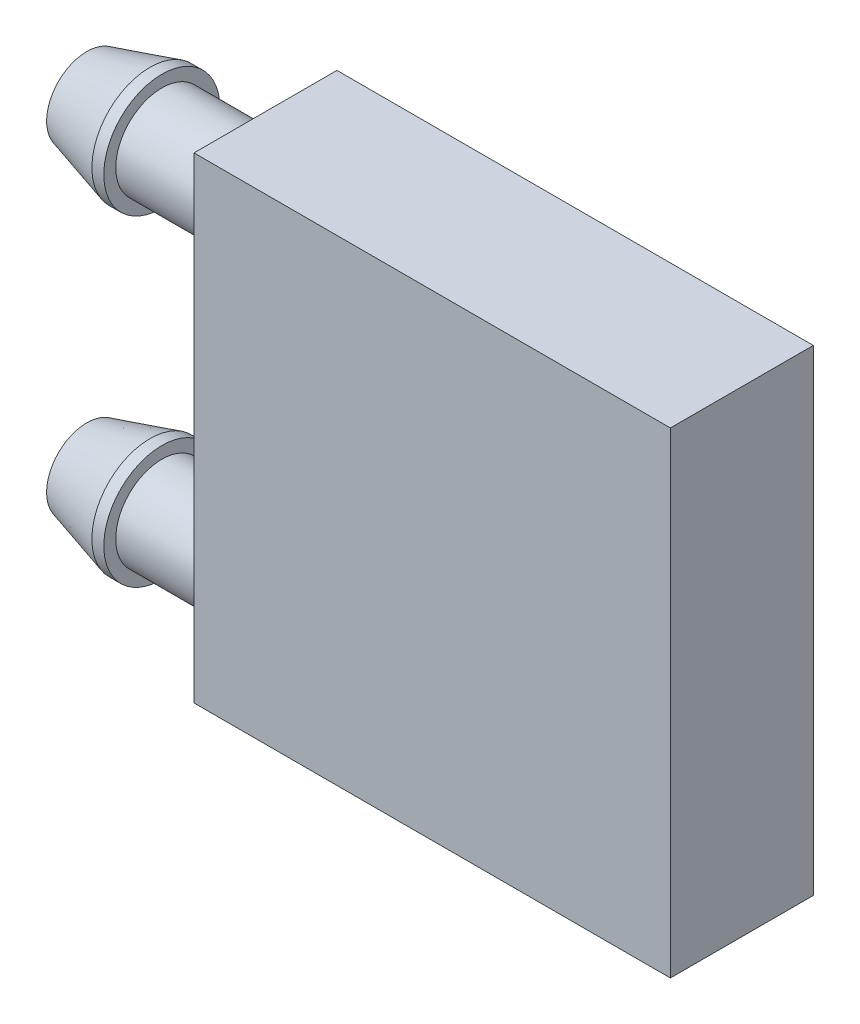
ISO-10303-21;
HEADER;
FILE_DESCRIPTION(('STEP AP214'),'2;1');
FILE_NAME('part.step','',(''),(''),'','','');
FILE_SCHEMA(('AUTOMOTIVE_DESIGN { 1 0 10303 214 1 1 1 1 }'));
ENDSEC;
DATA;
#1=APPLICATION_CONTEXT('core data for automotive mechanical design processes');
#2=APPLICATION_PROTOCOL_DEFINITION('international standard','automotive_design',2000,#1);
#3=PRODUCT_CONTEXT('',#1,'mechanical');
#4=PRODUCT('Part','Part','',(#3));
#5=PRODUCT_RELATED_PRODUCT_CATEGORY('part','',(#4));
#6=PRODUCT_DEFINITION_FORMATION('','',#4);
#7=PRODUCT_DEFINITION_CONTEXT('part definition',#1,'design');
#8=PRODUCT_DEFINITION('design','',#6,#7);
#9=PRODUCT_DEFINITION_SHAPE('','',#8);
#10=(LENGTH_UNIT() NAMED_UNIT(*) SI_UNIT(.MILLI.,.METRE.));
#11=(NAMED_UNIT(*) PLANE_ANGLE_UNIT() SI_UNIT($,.RADIAN.));
#12=(NAMED_UNIT(*) SI_UNIT($,.STERADIAN.) SOLID_ANGLE_UNIT());
#13=UNCERTAINTY_MEASURE_WITH_UNIT(LENGTH_MEASURE(1.E-05),#10,'distance_accuracy_value','');
#14=(GEOMETRIC_REPRESENTATION_CONTEXT(3) GLOBAL_UNCERTAINTY_ASSIGNED_CONTEXT((#13)) GLOBAL_UNIT_ASSIGNED_CONTEXT((#10,
#11,#12)) REPRESENTATION_CONTEXT('',''));
#15=CARTESIAN_POINT('',(0.,0.,0.));
#16=DIRECTION('',(0.,0.,1.));
#17=DIRECTION('',(1.,0.,0.));
#18=AXIS2_PLACEMENT_3D('',#15,#16,#17);
#19=CARTESIAN_POINT('',(-30.000000005,20.,-6.));
#20=DIRECTION('',(-1.,0.,0.));
#21=DIRECTION('',(0.,-1.,0.));
#22=AXIS2_PLACEMENT_3D('',#19,#20,#21);
#23=PLANE('',#22);
#24=CARTESIAN_POINT('',(-30.000000005,-13.5,0.));
#25=DIRECTION('',(-1.,0.,0.));
#26=DIRECTION('',(0.,-1.,0.));
#27=AXIS2_PLACEMENT_3D('',#24,#25,#26);
#28=CIRCLE('',#27,4.87500009200001);
#29=CARTESIAN_POINT('',(-30.000000005,-18.375000092,0.));
#30=VERTEX_POINT('',#29);
#31=EDGE_CURVE('E53',#30,#30,#28,.T.);
#32=ORIENTED_EDGE('',*,*,#31,.F.);
#33=EDGE_LOOP('',(#32));
#34=FACE_BOUND('',#33,.T.);
#35=CARTESIAN_POINT('',(-30.000000005,13.5,0.));
#36=DIRECTION('',(-1.,0.,0.));
#37=DIRECTION('',(0.,-1.,0.));
#38=AXIS2_PLACEMENT_3D('',#35,#36,#37);
#39=CIRCLE('',#38,4.87500009200001);
#40=CARTESIAN_POINT('',(-30.000000005,8.62499990799999,0.));
#41=VERTEX_POINT('',#40);
#42=EDGE_CURVE('E321',#41,#41,#39,.T.);
#43=ORIENTED_EDGE('',*,*,#42,.F.);
#44=EDGE_LOOP('',(#43));
#45=FACE_BOUND('',#44,.T.);
#46=DIRECTION('',(0.,0.,1.));
#47=VECTOR('',#46,1.);
#48=CARTESIAN_POINT('',(-30.000000005,-20.,-6.));
#49=LINE('',#48,#47);
#50=CARTESIAN_POINT('',(-30.000000005,-20.,-6.));
#51=VERTEX_POINT('',#50);
#52=CARTESIAN_POINT('',(-30.000000005,-20.,6.));
#53=VERTEX_POINT('',#52);
#54=EDGE_CURVE('E93',#51,#53,#49,.T.);
#55=ORIENTED_EDGE('',*,*,#54,.T.);
#56=DIRECTION('',(0.,-1.,0.));
#57=VECTOR('',#56,1.);
#58=CARTESIAN_POINT('',(-30.000000005,20.,6.));
#59=LINE('',#58,#57);
#60=CARTESIAN_POINT('',(-30.000000005,20.,6.));
#61=VERTEX_POINT('',#60);
#62=EDGE_CURVE('E96',#61,#53,#59,.T.);
#63=ORIENTED_EDGE('',*,*,#62,.F.);
#64=DIRECTION('',(0.,0.,1.));
#65=VECTOR('',#64,1.);
#66=CARTESIAN_POINT('',(-30.000000005,20.,-6.));
#67=LINE('',#66,#65);
#68=CARTESIAN_POINT('',(-30.000000005,20.,-6.));
#69=VERTEX_POINT('',#68);
#70=EDGE_CURVE('E63',#69,#61,#67,.T.);
#71=ORIENTED_EDGE('',*,*,#70,.F.);
#72=DIRECTION('',(0.,-1.,0.));
#73=VECTOR('',#72,1.);
#74=CARTESIAN_POINT('',(-30.000000005,20.,-6.));
#75=LINE('',#74,#73);
#76=EDGE_CURVE('E97',#69,#51,#75,.T.);
#77=ORIENTED_EDGE('',*,*,#76,.T.);
#78=EDGE_LOOP('',(#55,#63,#71,#77));
#79=FACE_BOUND('',#78,.T.);
#80=ADVANCED_FACE('F45',(#34,#45,#79),#23,.T.);
#81=CARTESIAN_POINT('',(-30.000000005,20.,-6.));
#82=DIRECTION('',(0.,1.,0.));
#83=DIRECTION('',(0.,0.,1.));
#84=AXIS2_PLACEMENT_3D('',#81,#82,#83);
#85=PLANE('',#84);
#86=ORIENTED_EDGE('',*,*,#70,.T.);
#87=DIRECTION('',(-1.,0.,0.));
#88=VECTOR('',#87,1.);
#89=CARTESIAN_POINT('',(-30.000000005,20.,6.));
#90=LINE('',#89,#88);
#91=CARTESIAN_POINT('',(10.000000005,20.,6.));
#92=VERTEX_POINT('',#91);
#93=EDGE_CURVE('E116',#92,#61,#90,.T.);
#94=ORIENTED_EDGE('',*,*,#93,.F.);
#95=DIRECTION('',(0.,0.,1.));
#96=VECTOR('',#95,1.);
#97=CARTESIAN_POINT('',(10.000000005,20.,-6.));
#98=LINE('',#97,#96);
#99=CARTESIAN_POINT('',(10.000000005,20.,-6.));
#100=VERTEX_POINT('',#99);
#101=EDGE_CURVE('E73',#100,#92,#98,.T.);
#102=ORIENTED_EDGE('',*,*,#101,.F.);
#103=DIRECTION('',(-1.,0.,0.));
#104=VECTOR('',#103,1.);
#105=CARTESIAN_POINT('',(-30.000000005,20.,-6.));
#106=LINE('',#105,#104);
#107=EDGE_CURVE('E103',#100,#69,#106,.T.);
#108=ORIENTED_EDGE('',*,*,#107,.T.);
#109=EDGE_LOOP('',(#86,#94,#102,#108));
#110=FACE_BOUND('',#109,.T.);
#111=ADVANCED_FACE('F179',(#110),#85,.T.);
#112=CARTESIAN_POINT('',(10.000000005,20.,-6.));
#113=DIRECTION('',(1.,0.,0.));
#114=DIRECTION('',(0.,0.,-1.));
#115=AXIS2_PLACEMENT_3D('',#112,#113,#114);
#116=PLANE('',#115);
#117=ORIENTED_EDGE('',*,*,#101,.T.);
#118=DIRECTION('',(0.,1.,0.));
#119=VECTOR('',#118,1.);
#120=CARTESIAN_POINT('',(10.000000005,20.,6.));
#121=LINE('',#120,#119);
#122=CARTESIAN_POINT('',(10.000000005,-20.,6.));
#123=VERTEX_POINT('',#122);
#124=EDGE_CURVE('E112',#123,#92,#121,.T.);
#125=ORIENTED_EDGE('',*,*,#124,.F.);
#126=DIRECTION('',(0.,0.,1.));
#127=VECTOR('',#126,1.);
#128=CARTESIAN_POINT('',(10.000000005,-20.,-6.));
#129=LINE('',#128,#127);
#130=CARTESIAN_POINT('',(10.000000005,-20.,-6.));
#131=VERTEX_POINT('',#130);
#132=EDGE_CURVE('E102',#131,#123,#129,.T.);
#133=ORIENTED_EDGE('',*,*,#132,.F.);
#134=DIRECTION('',(0.,1.,0.));
#135=VECTOR('',#134,1.);
#136=CARTESIAN_POINT('',(10.000000005,20.,-6.));
#137=LINE('',#136,#135);
#138=EDGE_CURVE('E173',#131,#100,#137,.T.);
#139=ORIENTED_EDGE('',*,*,#138,.T.);
#140=EDGE_LOOP('',(#117,#125,#133,#139));
#141=FACE_BOUND('',#140,.T.);
#142=ADVANCED_FACE('F300',(#141),#116,.T.);
#143=CARTESIAN_POINT('',(-30.000000005,-20.,-6.));
#144=DIRECTION('',(0.,-1.,0.));
#145=DIRECTION('',(0.,0.,-1.));
#146=AXIS2_PLACEMENT_3D('',#143,#144,#145);
#147=PLANE('',#146);
#148=ORIENTED_EDGE('',*,*,#132,.T.);
#149=DIRECTION('',(1.,0.,0.));
#150=VECTOR('',#149,1.);
#151=CARTESIAN_POINT('',(-30.000000005,-20.,6.));
#152=LINE('',#151,#150);
#153=EDGE_CURVE('E106',#53,#123,#152,.T.);
#154=ORIENTED_EDGE('',*,*,#153,.F.);
#155=ORIENTED_EDGE('',*,*,#54,.F.);
#156=DIRECTION('',(1.,0.,0.));
#157=VECTOR('',#156,1.);
#158=CARTESIAN_POINT('',(-30.000000005,-20.,-6.));
#159=LINE('',#158,#157);
#160=EDGE_CURVE('E145',#51,#131,#159,.T.);
#161=ORIENTED_EDGE('',*,*,#160,.T.);
#162=EDGE_LOOP('',(#148,#154,#155,#161));
#163=FACE_BOUND('',#162,.T.);
#164=ADVANCED_FACE('F107',(#163),#147,.T.);
#165=CARTESIAN_POINT('',(0.,0.,-6.));
#166=DIRECTION('',(0.,0.,1.));
#167=DIRECTION('',(1.,0.,0.));
#168=AXIS2_PLACEMENT_3D('',#165,#166,#167);
#169=PLANE('',#168);
#170=ORIENTED_EDGE('',*,*,#76,.F.);
#171=ORIENTED_EDGE('',*,*,#107,.F.);
#172=ORIENTED_EDGE('',*,*,#138,.F.);
#173=ORIENTED_EDGE('',*,*,#160,.F.);
#174=EDGE_LOOP('',(#170,#171,#172,#173));
#175=FACE_BOUND('',#174,.T.);
#176=ADVANCED_FACE('F182',(#175),#169,.F.);
#177=CARTESIAN_POINT('',(0.,0.,6.));
#178=DIRECTION('',(0.,0.,1.));
#179=DIRECTION('',(1.,0.,0.));
#180=AXIS2_PLACEMENT_3D('',#177,#178,#179);
#181=PLANE('',#180);
#182=ORIENTED_EDGE('',*,*,#62,.T.);
#183=ORIENTED_EDGE('',*,*,#153,.T.);
#184=ORIENTED_EDGE('',*,*,#124,.T.);
#185=ORIENTED_EDGE('',*,*,#93,.T.);
#186=EDGE_LOOP('',(#182,#183,#184,#185));
#187=FACE_BOUND('',#186,.T.);
#188=ADVANCED_FACE('F115',(#187),#181,.T.);
#189=CARTESIAN_POINT('',(-30.,13.5,0.));
#190=DIRECTION('',(1.,0.,0.));
#191=DIRECTION('',(0.,0.,-1.));
#192=AXIS2_PLACEMENT_3D('',#189,#190,#191);
#193=CYLINDRICAL_SURFACE('',#192,2.875000092);
#194=CARTESIAN_POINT('',(-30.000000005,13.5,0.));
#195=DIRECTION('',(-1.,0.,0.));
#196=DIRECTION('',(0.,-1.,0.));
#197=AXIS2_PLACEMENT_3D('',#194,#195,#196);
#198=CIRCLE('',#197,2.875000092);
#199=CARTESIAN_POINT('',(-30.000000005,10.624999908,0.));
#200=VERTEX_POINT('',#199);
#201=EDGE_CURVE('E187',#200,#200,#198,.F.);
#202=ORIENTED_EDGE('',*,*,#201,.T.);
#203=EDGE_LOOP('',(#202));
#204=FACE_BOUND('',#203,.T.);
#205=CARTESIAN_POINT('',(-45.000000005,13.5,0.));
#206=DIRECTION('',(1.,0.,0.));
#207=DIRECTION('',(0.,0.,-1.));
#208=AXIS2_PLACEMENT_3D('',#205,#206,#207);
#209=CIRCLE('',#208,2.875000092);
#210=CARTESIAN_POINT('',(-45.000000005,13.5,-2.875000092));
#211=VERTEX_POINT('',#210);
#212=EDGE_CURVE('E118',#211,#211,#209,.T.);
#213=ORIENTED_EDGE('',*,*,#212,.F.);
#214=EDGE_LOOP('',(#213));
#215=FACE_BOUND('',#214,.T.);
#216=ADVANCED_FACE('F357',(#204,#215),#193,.F.);
#217=CARTESIAN_POINT('',(-45.000000005,16.375000092,0.));
#218=DIRECTION('',(-1.,0.,0.));
#219=DIRECTION('',(0.,0.,1.));
#220=AXIS2_PLACEMENT_3D('',#217,#218,#219);
#221=PLANE('',#220);
#222=ORIENTED_EDGE('',*,*,#212,.T.);
#223=EDGE_LOOP('',(#222));
#224=FACE_BOUND('',#223,.T.);
#225=CARTESIAN_POINT('',(-45.000000005,13.5,0.));
#226=DIRECTION('',(1.,0.,0.));
#227=DIRECTION('',(0.,0.,-1.));
#228=AXIS2_PLACEMENT_3D('',#225,#226,#227);
#229=CIRCLE('',#228,3.375000092);
#230=CARTESIAN_POINT('',(-45.000000005,13.5,-3.375000092));
#231=VERTEX_POINT('',#230);
#232=EDGE_CURVE('E121',#231,#231,#229,.T.);
#233=ORIENTED_EDGE('',*,*,#232,.F.);
#234=EDGE_LOOP('',(#233));
#235=FACE_BOUND('',#234,.T.);
#236=ADVANCED_FACE('F353',(#224,#235),#221,.T.);
#237=CARTESIAN_POINT('',(-39.700000005,13.5,0.));
#238=DIRECTION('',(1.,0.,0.));
#239=DIRECTION('',(0.,0.,-1.));
#240=AXIS2_PLACEMENT_3D('',#237,#238,#239);
#241=CONICAL_SURFACE('',#240,4.875000092,0.275805898588523);
#242=ORIENTED_EDGE('',*,*,#232,.T.);
#243=EDGE_LOOP('',(#242));
#244=FACE_BOUND('',#243,.T.);
#245=CARTESIAN_POINT('',(-39.700000005,13.5,0.));
#246=DIRECTION('',(1.,0.,0.));
#247=DIRECTION('',(0.,0.,-1.));
#248=AXIS2_PLACEMENT_3D('',#245,#246,#247);
#249=CIRCLE('',#248,4.875000092);
#250=CARTESIAN_POINT('',(-39.700000005,13.5,-4.875000092));
#251=VERTEX_POINT('',#250);
#252=EDGE_CURVE('E228',#251,#251,#249,.T.);
#253=ORIENTED_EDGE('',*,*,#252,.F.);
#254=EDGE_LOOP('',(#253));
#255=FACE_BOUND('',#254,.T.);
#256=ADVANCED_FACE('F346',(#244,#255),#241,.T.);
#257=CARTESIAN_POINT('',(-30.,13.5,0.));
#258=DIRECTION('',(1.,0.,0.));
#259=DIRECTION('',(0.,0.,-1.));
#260=AXIS2_PLACEMENT_3D('',#257,#258,#259);
#261=CYLINDRICAL_SURFACE('',#260,4.875000092);
#262=ORIENTED_EDGE('',*,*,#252,.T.);
#263=EDGE_LOOP('',(#262));
#264=FACE_BOUND('',#263,.T.);
#265=CARTESIAN_POINT('',(-38.700000005,13.5,0.));
#266=DIRECTION('',(1.,0.,0.));
#267=DIRECTION('',(0.,0.,-1.));
#268=AXIS2_PLACEMENT_3D('',#265,#266,#267);
#269=CIRCLE('',#268,4.875000092);
#270=CARTESIAN_POINT('',(-38.700000005,13.5,-4.875000092));
#271=VERTEX_POINT('',#270);
#272=EDGE_CURVE('E223',#271,#271,#269,.T.);
#273=ORIENTED_EDGE('',*,*,#272,.F.);
#274=EDGE_LOOP('',(#273));
#275=FACE_BOUND('',#274,.T.);
#276=ADVANCED_FACE('F338',(#264,#275),#261,.T.);
#277=CARTESIAN_POINT('',(-38.700000005,18.375000092,0.));
#278=DIRECTION('',(1.,0.,0.));
#279=DIRECTION('',(0.,0.,-1.));
#280=AXIS2_PLACEMENT_3D('',#277,#278,#279);
#281=PLANE('',#280);
#282=ORIENTED_EDGE('',*,*,#272,.T.);
#283=EDGE_LOOP('',(#282));
#284=FACE_BOUND('',#283,.T.);
#285=CARTESIAN_POINT('',(-38.700000005,13.5,0.));
#286=DIRECTION('',(1.,0.,0.));
#287=DIRECTION('',(0.,0.,-1.));
#288=AXIS2_PLACEMENT_3D('',#285,#286,#287);
#289=CIRCLE('',#288,3.875000092);
#290=CARTESIAN_POINT('',(-38.700000005,13.5,-3.875000092));
#291=VERTEX_POINT('',#290);
#292=EDGE_CURVE('E229',#291,#291,#289,.T.);
#293=ORIENTED_EDGE('',*,*,#292,.F.);
#294=EDGE_LOOP('',(#293));
#295=FACE_BOUND('',#294,.T.);
#296=ADVANCED_FACE('F336',(#284,#295),#281,.T.);
#297=CARTESIAN_POINT('',(-30.,13.5,0.));
#298=DIRECTION('',(1.,0.,0.));
#299=DIRECTION('',(0.,0.,-1.));
#300=AXIS2_PLACEMENT_3D('',#297,#298,#299);
#301=CYLINDRICAL_SURFACE('',#300,3.875000092);
#302=ORIENTED_EDGE('',*,*,#292,.T.);
#303=EDGE_LOOP('',(#302));
#304=FACE_BOUND('',#303,.T.);
#305=CARTESIAN_POINT('',(-31.000000037,13.5,0.));
#306=DIRECTION('',(1.,0.,0.));
#307=DIRECTION('',(0.,0.,-1.));
#308=AXIS2_PLACEMENT_3D('',#305,#306,#307);
#309=CIRCLE('',#308,3.87500009199999);
#310=CARTESIAN_POINT('',(-31.000000037,13.5,-3.87500009199999));
#311=VERTEX_POINT('',#310);
#312=EDGE_CURVE('E242',#311,#311,#309,.T.);
#313=ORIENTED_EDGE('',*,*,#312,.F.);
#314=EDGE_LOOP('',(#313));
#315=FACE_BOUND('',#314,.T.);
#316=ADVANCED_FACE('F333',(#304,#315),#301,.T.);
#317=CARTESIAN_POINT('',(-31.000000037,17.375000092,0.));
#318=DIRECTION('',(-1.,0.,0.));
#319=DIRECTION('',(0.,0.,1.));
#320=AXIS2_PLACEMENT_3D('',#317,#318,#319);
#321=PLANE('',#320);
#322=ORIENTED_EDGE('',*,*,#312,.T.);
#323=EDGE_LOOP('',(#322));
#324=FACE_BOUND('',#323,.T.);
#325=CARTESIAN_POINT('',(-31.000000037,13.5,0.));
#326=DIRECTION('',(1.,0.,0.));
#327=DIRECTION('',(0.,0.,-1.));
#328=AXIS2_PLACEMENT_3D('',#325,#326,#327);
#329=CIRCLE('',#328,4.87500009200001);
#330=CARTESIAN_POINT('',(-31.000000037,13.5,-4.87500009200001));
#331=VERTEX_POINT('',#330);
#332=EDGE_CURVE('E246',#331,#331,#329,.T.);
#333=ORIENTED_EDGE('',*,*,#332,.F.);
#334=EDGE_LOOP('',(#333));
#335=FACE_BOUND('',#334,.T.);
#336=ADVANCED_FACE('F315',(#324,#335),#321,.T.);
#337=CARTESIAN_POINT('',(-30.,13.5,0.));
#338=DIRECTION('',(1.,0.,0.));
#339=DIRECTION('',(0.,0.,-1.));
#340=AXIS2_PLACEMENT_3D('',#337,#338,#339);
#341=CYLINDRICAL_SURFACE('',#340,4.87500009200001);
#342=ORIENTED_EDGE('',*,*,#332,.T.);
#343=EDGE_LOOP('',(#342));
#344=FACE_BOUND('',#343,.T.);
#345=ORIENTED_EDGE('',*,*,#42,.T.);
#346=EDGE_LOOP('',(#345));
#347=FACE_BOUND('',#346,.T.);
#348=ADVANCED_FACE('F307',(#344,#347),#341,.T.);
#349=ORIENTED_EDGE('',*,*,#201,.F.);
#350=EDGE_LOOP('',(#349));
#351=FACE_BOUND('',#350,.T.);
#352=ADVANCED_FACE('F296',(#351),#23,.T.);
#353=CARTESIAN_POINT('',(-30.,-13.5,0.));
#354=DIRECTION('',(1.,0.,0.));
#355=DIRECTION('',(0.,0.,-1.));
#356=AXIS2_PLACEMENT_3D('',#353,#354,#355);
#357=CYLINDRICAL_SURFACE('',#356,2.875000092);
#358=CARTESIAN_POINT('',(-30.000000005,-13.5,0.));
#359=DIRECTION('',(-1.,0.,0.));
#360=DIRECTION('',(0.,-1.,0.));
#361=AXIS2_PLACEMENT_3D('',#358,#359,#360);
#362=CIRCLE('',#361,2.875000092);
#363=CARTESIAN_POINT('',(-30.000000005,-16.375000092,0.));
#364=VERTEX_POINT('',#363);
#365=EDGE_CURVE('E12',#364,#364,#362,.F.);
#366=ORIENTED_EDGE('',*,*,#365,.T.);
#367=EDGE_LOOP('',(#366));
#368=FACE_BOUND('',#367,.T.);
#369=CARTESIAN_POINT('',(-45.000000005,-13.5,0.));
#370=DIRECTION('',(-1.,0.,0.));
#371=DIRECTION('',(0.,0.,-1.));
#372=AXIS2_PLACEMENT_3D('',#369,#370,#371);
#373=CIRCLE('',#372,2.875000092);
#374=CARTESIAN_POINT('',(-45.000000005,-13.5,-2.875000092));
#375=VERTEX_POINT('',#374);
#376=EDGE_CURVE('E217',#375,#375,#373,.T.);
#377=ORIENTED_EDGE('',*,*,#376,.T.);
#378=EDGE_LOOP('',(#377));
#379=FACE_BOUND('',#378,.T.);
#380=ADVANCED_FACE('F257',(#368,#379),#357,.F.);
#381=CARTESIAN_POINT('',(-45.000000005,-16.375000092,0.));
#382=DIRECTION('',(-1.,0.,0.));
#383=DIRECTION('',(0.,0.,1.));
#384=AXIS2_PLACEMENT_3D('',#381,#382,#383);
#385=PLANE('',#384);
#386=ORIENTED_EDGE('',*,*,#376,.F.);
#387=EDGE_LOOP('',(#386));
#388=FACE_BOUND('',#387,.T.);
#389=CARTESIAN_POINT('',(-45.000000005,-13.5,0.));
#390=DIRECTION('',(-1.,0.,0.));
#391=DIRECTION('',(0.,0.,-1.));
#392=AXIS2_PLACEMENT_3D('',#389,#390,#391);
#393=CIRCLE('',#392,3.375000092);
#394=CARTESIAN_POINT('',(-45.000000005,-13.5,-3.375000092));
#395=VERTEX_POINT('',#394);
#396=EDGE_CURVE('E212',#395,#395,#393,.T.);
#397=ORIENTED_EDGE('',*,*,#396,.T.);
#398=EDGE_LOOP('',(#397));
#399=FACE_BOUND('',#398,.T.);
#400=ADVANCED_FACE('F259',(#388,#399),#385,.T.);
#401=CARTESIAN_POINT('',(-39.700000005,-13.5,0.));
#402=DIRECTION('',(1.,0.,0.));
#403=DIRECTION('',(0.,0.,-1.));
#404=AXIS2_PLACEMENT_3D('',#401,#402,#403);
#405=CONICAL_SURFACE('',#404,4.875000092,0.275805898588523);
#406=ORIENTED_EDGE('',*,*,#396,.F.);
#407=EDGE_LOOP('',(#406));
#408=FACE_BOUND('',#407,.T.);
#409=CARTESIAN_POINT('',(-39.700000005,-13.5,0.));
#410=DIRECTION('',(-1.,0.,0.));
#411=DIRECTION('',(0.,0.,-1.));
#412=AXIS2_PLACEMENT_3D('',#409,#410,#411);
#413=CIRCLE('',#412,4.875000092);
#414=CARTESIAN_POINT('',(-39.700000005,-13.5,-4.875000092));
#415=VERTEX_POINT('',#414);
#416=EDGE_CURVE('E207',#415,#415,#413,.T.);
#417=ORIENTED_EDGE('',*,*,#416,.T.);
#418=EDGE_LOOP('',(#417));
#419=FACE_BOUND('',#418,.T.);
#420=ADVANCED_FACE('F262',(#408,#419),#405,.T.);
#421=CARTESIAN_POINT('',(-30.,-13.5,0.));
#422=DIRECTION('',(1.,0.,0.));
#423=DIRECTION('',(0.,0.,-1.));
#424=AXIS2_PLACEMENT_3D('',#421,#422,#423);
#425=CYLINDRICAL_SURFACE('',#424,4.875000092);
#426=ORIENTED_EDGE('',*,*,#416,.F.);
#427=EDGE_LOOP('',(#426));
#428=FACE_BOUND('',#427,.T.);
#429=CARTESIAN_POINT('',(-38.700000005,-13.5,0.));
#430=DIRECTION('',(-1.,0.,0.));
#431=DIRECTION('',(0.,0.,-1.));
#432=AXIS2_PLACEMENT_3D('',#429,#430,#431);
#433=CIRCLE('',#432,4.875000092);
#434=CARTESIAN_POINT('',(-38.700000005,-13.5,-4.875000092));
#435=VERTEX_POINT('',#434);
#436=EDGE_CURVE('E199',#435,#435,#433,.T.);
#437=ORIENTED_EDGE('',*,*,#436,.T.);
#438=EDGE_LOOP('',(#437));
#439=FACE_BOUND('',#438,.T.);
#440=ADVANCED_FACE('F268',(#428,#439),#425,.T.);
#441=CARTESIAN_POINT('',(-38.700000005,-18.375000092,0.));
#442=DIRECTION('',(1.,0.,0.));
#443=DIRECTION('',(0.,0.,-1.));
#444=AXIS2_PLACEMENT_3D('',#441,#442,#443);
#445=PLANE('',#444);
#446=ORIENTED_EDGE('',*,*,#436,.F.);
#447=EDGE_LOOP('',(#446));
#448=FACE_BOUND('',#447,.T.);
#449=CARTESIAN_POINT('',(-38.700000005,-13.5,0.));
#450=DIRECTION('',(-1.,0.,0.));
#451=DIRECTION('',(0.,0.,-1.));
#452=AXIS2_PLACEMENT_3D('',#449,#450,#451);
#453=CIRCLE('',#452,3.875000092);
#454=CARTESIAN_POINT('',(-38.700000005,-13.5,-3.875000092));
#455=VERTEX_POINT('',#454);
#456=EDGE_CURVE('E193',#455,#455,#453,.T.);
#457=ORIENTED_EDGE('',*,*,#456,.T.);
#458=EDGE_LOOP('',(#457));
#459=FACE_BOUND('',#458,.T.);
#460=ADVANCED_FACE('F274',(#448,#459),#445,.T.);
#461=CARTESIAN_POINT('',(-30.,-13.5,0.));
#462=DIRECTION('',(1.,0.,0.));
#463=DIRECTION('',(0.,0.,-1.));
#464=AXIS2_PLACEMENT_3D('',#461,#462,#463);
#465=CYLINDRICAL_SURFACE('',#464,3.875000092);
#466=ORIENTED_EDGE('',*,*,#456,.F.);
#467=EDGE_LOOP('',(#466));
#468=FACE_BOUND('',#467,.T.);
#469=CARTESIAN_POINT('',(-31.000000037,-13.5,0.));
#470=DIRECTION('',(-1.,0.,0.));
#471=DIRECTION('',(0.,0.,-1.));
#472=AXIS2_PLACEMENT_3D('',#469,#470,#471);
#473=CIRCLE('',#472,3.87500009199999);
#474=CARTESIAN_POINT('',(-31.000000037,-13.5,-3.87500009199999));
#475=VERTEX_POINT('',#474);
#476=EDGE_CURVE('E190',#475,#475,#473,.T.);
#477=ORIENTED_EDGE('',*,*,#476,.T.);
#478=EDGE_LOOP('',(#477));
#479=FACE_BOUND('',#478,.T.);
#480=ADVANCED_FACE('F280',(#468,#479),#465,.T.);
#481=CARTESIAN_POINT('',(-31.000000037,-17.375000092,0.));
#482=DIRECTION('',(-1.,0.,0.));
#483=DIRECTION('',(0.,0.,1.));
#484=AXIS2_PLACEMENT_3D('',#481,#482,#483);
#485=PLANE('',#484);
#486=ORIENTED_EDGE('',*,*,#476,.F.);
#487=EDGE_LOOP('',(#486));
#488=FACE_BOUND('',#487,.T.);
#489=CARTESIAN_POINT('',(-31.000000037,-13.5,0.));
#490=DIRECTION('',(-1.,0.,0.));
#491=DIRECTION('',(0.,0.,-1.));
#492=AXIS2_PLACEMENT_3D('',#489,#490,#491);
#493=CIRCLE('',#492,4.87500009200001);
#494=CARTESIAN_POINT('',(-31.000000037,-13.5,-4.87500009200001));
#495=VERTEX_POINT('',#494);
#496=EDGE_CURVE('E188',#495,#495,#493,.T.);
#497=ORIENTED_EDGE('',*,*,#496,.T.);
#498=EDGE_LOOP('',(#497));
#499=FACE_BOUND('',#498,.T.);
#500=ADVANCED_FACE('F285',(#488,#499),#485,.T.);
#501=CARTESIAN_POINT('',(-30.,-13.5,0.));
#502=DIRECTION('',(1.,0.,0.));
#503=DIRECTION('',(0.,0.,-1.));
#504=AXIS2_PLACEMENT_3D('',#501,#502,#503);
#505=CYLINDRICAL_SURFACE('',#504,4.87500009200001);
#506=ORIENTED_EDGE('',*,*,#496,.F.);
#507=EDGE_LOOP('',(#506));
#508=FACE_BOUND('',#507,.T.);
#509=ORIENTED_EDGE('',*,*,#31,.T.);
#510=EDGE_LOOP('',(#509));
#511=FACE_BOUND('',#510,.T.);
#512=ADVANCED_FACE('F290',(#508,#511),#505,.T.);
#513=ORIENTED_EDGE('',*,*,#365,.F.);
#514=EDGE_LOOP('',(#513));
#515=FACE_BOUND('',#514,.T.);
#516=ADVANCED_FACE('F295',(#515),#23,.T.);
#517=CLOSED_SHELL('',(#80,#111,#142,#164,#176,#188,#216,#236,#256,#276,#296,#316,#336,#348,#352,
#380,#400,#420,#440,#460,#480,#500,#512,#516));
#518=MANIFOLD_SOLID_BREP('B2',#517);
#519=ADVANCED_BREP_SHAPE_REPRESENTATION('',(#18,#518),#14);
#520=SHAPE_DEFINITION_REPRESENTATION(#9,#519);
ENDSEC;
END-ISO-10303-21;
